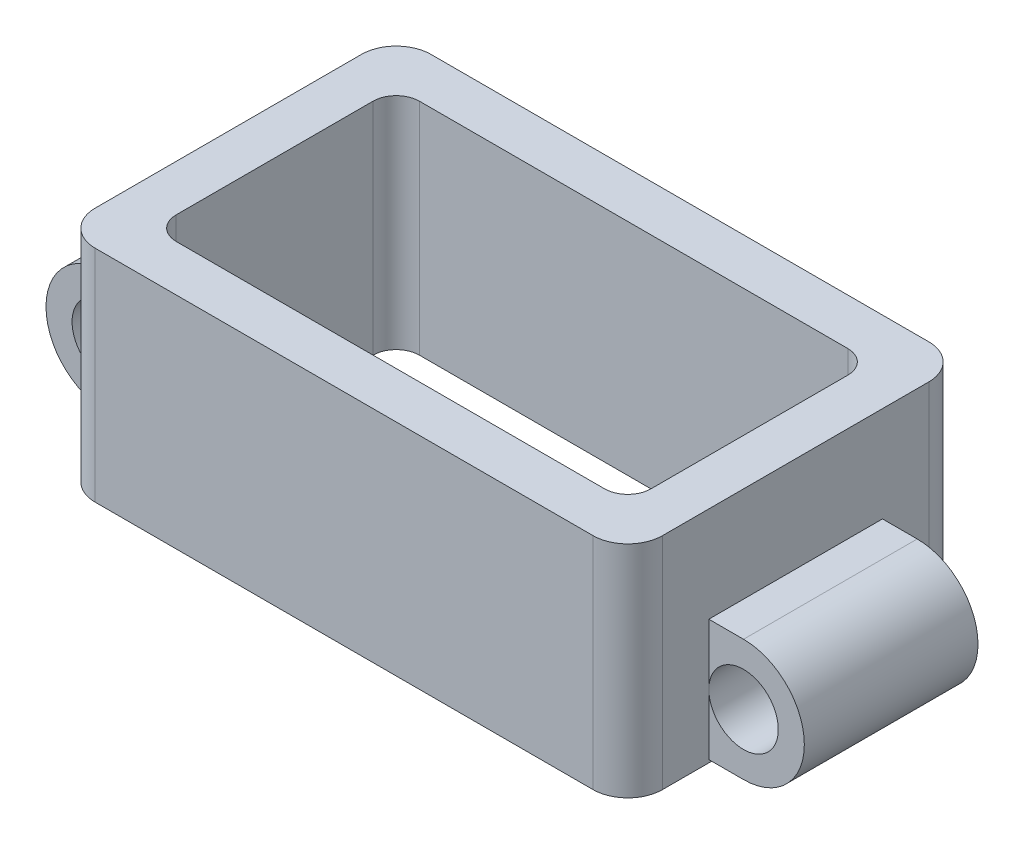
ISO-10303-21;
HEADER;
FILE_DESCRIPTION(('STEP AP214'),'2;1');
FILE_NAME('part.step','',(''),(''),'','','');
FILE_SCHEMA(('AUTOMOTIVE_DESIGN { 1 0 10303 214 1 1 1 1 }'));
ENDSEC;
DATA;
#1=APPLICATION_CONTEXT('core data for automotive mechanical design processes');
#2=APPLICATION_PROTOCOL_DEFINITION('international standard','automotive_design',2000,#1);
#3=PRODUCT_CONTEXT('',#1,'mechanical');
#4=PRODUCT('Part','Part','',(#3));
#5=PRODUCT_RELATED_PRODUCT_CATEGORY('part','',(#4));
#6=PRODUCT_DEFINITION_FORMATION('','',#4);
#7=PRODUCT_DEFINITION_CONTEXT('part definition',#1,'design');
#8=PRODUCT_DEFINITION('design','',#6,#7);
#9=PRODUCT_DEFINITION_SHAPE('','',#8);
#10=(LENGTH_UNIT() NAMED_UNIT(*) SI_UNIT(.MILLI.,.METRE.));
#11=(NAMED_UNIT(*) PLANE_ANGLE_UNIT() SI_UNIT($,.RADIAN.));
#12=(NAMED_UNIT(*) SI_UNIT($,.STERADIAN.) SOLID_ANGLE_UNIT());
#13=UNCERTAINTY_MEASURE_WITH_UNIT(LENGTH_MEASURE(1.E-05),#10,'distance_accuracy_value','');
#14=(GEOMETRIC_REPRESENTATION_CONTEXT(3) GLOBAL_UNCERTAINTY_ASSIGNED_CONTEXT((#13)) GLOBAL_UNIT_ASSIGNED_CONTEXT((#10,
#11,#12)) REPRESENTATION_CONTEXT('',''));
#15=CARTESIAN_POINT('',(0.,0.,0.));
#16=DIRECTION('',(0.,0.,1.));
#17=DIRECTION('',(1.,0.,0.));
#18=AXIS2_PLACEMENT_3D('',#15,#16,#17);
#19=CARTESIAN_POINT('',(10.9204858758298,10.75,26.156539988134));
#20=DIRECTION('',(0.,-1.,0.));
#21=DIRECTION('',(0.,0.,-1.));
#22=AXIS2_PLACEMENT_3D('',#19,#20,#21);
#23=PLANE('',#22);
#24=DIRECTION('',(0.,0.,-1.));
#25=VECTOR('',#24,1.);
#26=CARTESIAN_POINT('',(-5.07951412417015,10.75,33.157539988134));
#27=LINE('',#26,#25);
#28=CARTESIAN_POINT('',(-5.07951412417015,10.75,26.156539988134));
#29=VERTEX_POINT('',#28);
#30=CARTESIAN_POINT('',(-5.07951412417016,10.75,11.156539988134));
#31=VERTEX_POINT('',#30);
#32=EDGE_CURVE('E205',#29,#31,#27,.T.);
#33=ORIENTED_EDGE('',*,*,#32,.T.);
#34=DIRECTION('',(-1.,0.,0.));
#35=VECTOR('',#34,1.);
#36=CARTESIAN_POINT('',(10.9204858758298,10.75,11.156539988134));
#37=LINE('',#36,#35);
#38=CARTESIAN_POINT('',(-8.07951412417015,10.75,11.156539988134));
#39=VERTEX_POINT('',#38);
#40=EDGE_CURVE('E228',#31,#39,#37,.T.);
#41=ORIENTED_EDGE('',*,*,#40,.T.);
#42=DIRECTION('',(0.,0.,1.));
#43=VECTOR('',#42,1.);
#44=CARTESIAN_POINT('',(-8.07951412417015,10.75,26.156539988134));
#45=LINE('',#44,#43);
#46=CARTESIAN_POINT('',(-8.07951412417015,10.75,26.156539988134));
#47=VERTEX_POINT('',#46);
#48=EDGE_CURVE('E637',#39,#47,#45,.T.);
#49=ORIENTED_EDGE('',*,*,#48,.T.);
#50=DIRECTION('',(-1.,0.,0.));
#51=VECTOR('',#50,1.);
#52=CARTESIAN_POINT('',(10.9204858758298,10.75,26.156539988134));
#53=LINE('',#52,#51);
#54=EDGE_CURVE('E640',#29,#47,#53,.T.);
#55=ORIENTED_EDGE('',*,*,#54,.F.);
#56=EDGE_LOOP('',(#33,#41,#49,#55));
#57=FACE_BOUND('',#56,.T.);
#58=ADVANCED_FACE('F32',(#57),#23,.F.);
#59=CARTESIAN_POINT('',(-57.0795141241702,19.,4.15653998813402));
#60=DIRECTION('',(1.,0.,0.));
#61=DIRECTION('',(0.,0.,-1.));
#62=AXIS2_PLACEMENT_3D('',#59,#60,#61);
#63=PLANE('',#62);
#64=DIRECTION('',(0.,0.,1.));
#65=VECTOR('',#64,1.);
#66=CARTESIAN_POINT('',(-57.0795141241702,19.,4.15653998813402));
#67=LINE('',#66,#65);
#68=CARTESIAN_POINT('',(-57.0795141241702,19.,7.15653998813402));
#69=VERTEX_POINT('',#68);
#70=CARTESIAN_POINT('',(-57.0795141241702,19.,30.156539988134));
#71=VERTEX_POINT('',#70);
#72=EDGE_CURVE('E253',#69,#71,#67,.T.);
#73=ORIENTED_EDGE('',*,*,#72,.F.);
#74=DIRECTION('',(0.,-1.,0.));
#75=VECTOR('',#74,1.);
#76=CARTESIAN_POINT('',(-57.0795141241702,19.,7.15653998813402));
#77=LINE('',#76,#75);
#78=CARTESIAN_POINT('',(-57.0795141241702,0.,7.15653998813402));
#79=VERTEX_POINT('',#78);
#80=EDGE_CURVE('E278',#69,#79,#77,.T.);
#81=ORIENTED_EDGE('',*,*,#80,.T.);
#82=DIRECTION('',(0.,0.,1.));
#83=VECTOR('',#82,1.);
#84=CARTESIAN_POINT('',(-57.0795141241702,0.,4.15653998813402));
#85=LINE('',#84,#83);
#86=CARTESIAN_POINT('',(-57.0795141241702,0.,30.156539988134));
#87=VERTEX_POINT('',#86);
#88=EDGE_CURVE('E244',#79,#87,#85,.T.);
#89=ORIENTED_EDGE('',*,*,#88,.T.);
#90=DIRECTION('',(0.,-1.,0.));
#91=VECTOR('',#90,1.);
#92=CARTESIAN_POINT('',(-57.0795141241702,19.,30.156539988134));
#93=LINE('',#92,#91);
#94=EDGE_CURVE('E266',#87,#71,#93,.F.);
#95=ORIENTED_EDGE('',*,*,#94,.T.);
#96=EDGE_LOOP('',(#73,#81,#89,#95));
#97=FACE_BOUND('',#96,.T.);
#98=DIRECTION('',(0.,0.,-1.));
#99=VECTOR('',#98,1.);
#100=CARTESIAN_POINT('',(-57.0795141241702,10.75,26.156539988134));
#101=LINE('',#100,#99);
#102=CARTESIAN_POINT('',(-57.0795141241702,10.75,26.156539988134));
#103=VERTEX_POINT('',#102);
#104=CARTESIAN_POINT('',(-57.0795141241702,10.75,11.156539988134));
#105=VERTEX_POINT('',#104);
#106=EDGE_CURVE('E605',#103,#105,#101,.T.);
#107=ORIENTED_EDGE('',*,*,#106,.F.);
#108=DIRECTION('',(0.,-1.,0.));
#109=VECTOR('',#108,1.);
#110=CARTESIAN_POINT('',(-57.0795141241702,10.75,26.156539988134));
#111=LINE('',#110,#109);
#112=CARTESIAN_POINT('',(-57.0795141241702,5.5,26.156539988134));
#113=VERTEX_POINT('',#112);
#114=EDGE_CURVE('E618',#103,#113,#111,.T.);
#115=ORIENTED_EDGE('',*,*,#114,.T.);
#116=CARTESIAN_POINT('',(-57.0795141241702,0.25,26.156539988134));
#117=VERTEX_POINT('',#116);
#118=EDGE_CURVE('E617',#113,#117,#111,.T.);
#119=ORIENTED_EDGE('',*,*,#118,.T.);
#120=DIRECTION('',(0.,0.,-1.));
#121=VECTOR('',#120,1.);
#122=CARTESIAN_POINT('',(-57.0795141241702,0.25,26.156539988134));
#123=LINE('',#122,#121);
#124=CARTESIAN_POINT('',(-57.0795141241702,0.249999999999998,11.156539988134));
#125=VERTEX_POINT('',#124);
#126=EDGE_CURVE('E614',#117,#125,#123,.T.);
#127=ORIENTED_EDGE('',*,*,#126,.T.);
#128=DIRECTION('',(0.,-1.,0.));
#129=VECTOR('',#128,1.);
#130=CARTESIAN_POINT('',(-57.0795141241702,10.75,11.156539988134));
#131=LINE('',#130,#129);
#132=CARTESIAN_POINT('',(-57.0795141241702,5.5,11.156539988134));
#133=VERTEX_POINT('',#132);
#134=EDGE_CURVE('E610',#133,#125,#131,.T.);
#135=ORIENTED_EDGE('',*,*,#134,.F.);
#136=EDGE_CURVE('E611',#105,#133,#131,.T.);
#137=ORIENTED_EDGE('',*,*,#136,.F.);
#138=EDGE_LOOP('',(#107,#115,#119,#127,#135,#137));
#139=FACE_BOUND('',#138,.T.);
#140=ADVANCED_FACE('F389',(#97,#139),#63,.F.);
#141=CARTESIAN_POINT('',(-8.07951412417016,19.,4.15653998813402));
#142=DIRECTION('',(-1.,0.,0.));
#143=DIRECTION('',(0.,0.,1.));
#144=AXIS2_PLACEMENT_3D('',#141,#142,#143);
#145=PLANE('',#144);
#146=DIRECTION('',(0.,0.,-1.));
#147=VECTOR('',#146,1.);
#148=CARTESIAN_POINT('',(-8.07951412417016,0.,4.15653998813402));
#149=LINE('',#148,#147);
#150=CARTESIAN_POINT('',(-8.07951412417015,0.,30.156539988134));
#151=VERTEX_POINT('',#150);
#152=CARTESIAN_POINT('',(-8.07951412417016,0.,7.15653998813401));
#153=VERTEX_POINT('',#152);
#154=EDGE_CURVE('E272',#151,#153,#149,.T.);
#155=ORIENTED_EDGE('',*,*,#154,.T.);
#156=DIRECTION('',(0.,-1.,0.));
#157=VECTOR('',#156,1.);
#158=CARTESIAN_POINT('',(-8.07951412417016,19.,7.15653998813402));
#159=LINE('',#158,#157);
#160=CARTESIAN_POINT('',(-8.07951412417016,19.,7.15653998813401));
#161=VERTEX_POINT('',#160);
#162=EDGE_CURVE('E310',#153,#161,#159,.F.);
#163=ORIENTED_EDGE('',*,*,#162,.T.);
#164=DIRECTION('',(0.,0.,-1.));
#165=VECTOR('',#164,1.);
#166=CARTESIAN_POINT('',(-8.07951412417016,19.,4.15653998813402));
#167=LINE('',#166,#165);
#168=CARTESIAN_POINT('',(-8.07951412417015,19.,30.156539988134));
#169=VERTEX_POINT('',#168);
#170=EDGE_CURVE('E260',#169,#161,#167,.T.);
#171=ORIENTED_EDGE('',*,*,#170,.F.);
#172=DIRECTION('',(0.,-1.,0.));
#173=VECTOR('',#172,1.);
#174=CARTESIAN_POINT('',(-8.07951412417015,19.,30.156539988134));
#175=LINE('',#174,#173);
#176=EDGE_CURVE('E307',#169,#151,#175,.T.);
#177=ORIENTED_EDGE('',*,*,#176,.T.);
#178=EDGE_LOOP('',(#155,#163,#171,#177));
#179=FACE_BOUND('',#178,.T.);
#180=DIRECTION('',(0.,-1.,0.));
#181=VECTOR('',#180,1.);
#182=CARTESIAN_POINT('',(-8.07951412417015,0.25,26.156539988134));
#183=LINE('',#182,#181);
#184=CARTESIAN_POINT('',(-8.07951412417015,5.5,26.156539988134));
#185=VERTEX_POINT('',#184);
#186=EDGE_CURVE('E629',#47,#185,#183,.T.);
#187=ORIENTED_EDGE('',*,*,#186,.F.);
#188=ORIENTED_EDGE('',*,*,#48,.F.);
#189=DIRECTION('',(0.,1.,0.));
#190=VECTOR('',#189,1.);
#191=CARTESIAN_POINT('',(-8.07951412417015,0.25,11.156539988134));
#192=LINE('',#191,#190);
#193=CARTESIAN_POINT('',(-8.07951412417015,5.5,11.156539988134));
#194=VERTEX_POINT('',#193);
#195=EDGE_CURVE('E634',#194,#39,#192,.T.);
#196=ORIENTED_EDGE('',*,*,#195,.F.);
#197=CARTESIAN_POINT('',(-8.07951412417015,0.25,11.156539988134));
#198=VERTEX_POINT('',#197);
#199=EDGE_CURVE('E635',#198,#194,#192,.T.);
#200=ORIENTED_EDGE('',*,*,#199,.F.);
#201=DIRECTION('',(0.,0.,-1.));
#202=VECTOR('',#201,1.);
#203=CARTESIAN_POINT('',(-8.07951412417015,0.25,26.156539988134));
#204=LINE('',#203,#202);
#205=CARTESIAN_POINT('',(-8.07951412417015,0.25,26.156539988134));
#206=VERTEX_POINT('',#205);
#207=EDGE_CURVE('E632',#206,#198,#204,.T.);
#208=ORIENTED_EDGE('',*,*,#207,.F.);
#209=EDGE_CURVE('E221',#185,#206,#183,.T.);
#210=ORIENTED_EDGE('',*,*,#209,.F.);
#211=EDGE_LOOP('',(#187,#188,#196,#200,#208,#210));
#212=FACE_BOUND('',#211,.T.);
#213=ADVANCED_FACE('F395',(#179,#212),#145,.F.);
#214=CARTESIAN_POINT('',(0.,19.,0.));
#215=DIRECTION('',(0.,1.,0.));
#216=DIRECTION('',(0.,0.,1.));
#217=AXIS2_PLACEMENT_3D('',#214,#215,#216);
#218=PLANE('',#217);
#219=DIRECTION('',(-1.,0.,0.));
#220=VECTOR('',#219,1.);
#221=CARTESIAN_POINT('',(-57.0795141241702,19.,4.15653998813402));
#222=LINE('',#221,#220);
#223=CARTESIAN_POINT('',(-11.0795141241702,19.,4.15653998813402));
#224=VERTEX_POINT('',#223);
#225=CARTESIAN_POINT('',(-54.0795141241702,19.,4.15653998813402));
#226=VERTEX_POINT('',#225);
#227=EDGE_CURVE('E263',#224,#226,#222,.T.);
#228=ORIENTED_EDGE('',*,*,#227,.T.);
#229=CARTESIAN_POINT('',(-54.0795141241702,19.,7.15653998813402));
#230=DIRECTION('',(0.,1.,0.));
#231=DIRECTION('',(0.,0.,1.));
#232=AXIS2_PLACEMENT_3D('',#229,#230,#231);
#233=CIRCLE('',#232,3.);
#234=EDGE_CURVE('E300',#226,#69,#233,.T.);
#235=ORIENTED_EDGE('',*,*,#234,.T.);
#236=ORIENTED_EDGE('',*,*,#72,.T.);
#237=CARTESIAN_POINT('',(-54.0795141241701,19.,30.156539988134));
#238=DIRECTION('',(0.,1.,0.));
#239=DIRECTION('',(0.,0.,1.));
#240=AXIS2_PLACEMENT_3D('',#237,#238,#239);
#241=CIRCLE('',#240,3.);
#242=CARTESIAN_POINT('',(-54.0795141241701,19.,33.156539988134));
#243=VERTEX_POINT('',#242);
#244=EDGE_CURVE('E298',#71,#243,#241,.T.);
#245=ORIENTED_EDGE('',*,*,#244,.T.);
#246=DIRECTION('',(1.,0.,0.));
#247=VECTOR('',#246,1.);
#248=CARTESIAN_POINT('',(-57.0795141241702,19.,33.156539988134));
#249=LINE('',#248,#247);
#250=CARTESIAN_POINT('',(-11.0795141241702,19.,33.156539988134));
#251=VERTEX_POINT('',#250);
#252=EDGE_CURVE('E256',#243,#251,#249,.T.);
#253=ORIENTED_EDGE('',*,*,#252,.T.);
#254=CARTESIAN_POINT('',(-11.0795141241701,19.,30.156539988134));
#255=DIRECTION('',(0.,1.,0.));
#256=DIRECTION('',(0.,0.,1.));
#257=AXIS2_PLACEMENT_3D('',#254,#255,#256);
#258=CIRCLE('',#257,3.);
#259=EDGE_CURVE('E294',#251,#169,#258,.T.);
#260=ORIENTED_EDGE('',*,*,#259,.T.);
#261=ORIENTED_EDGE('',*,*,#170,.T.);
#262=CARTESIAN_POINT('',(-11.0795141241702,19.,7.15653998813402));
#263=DIRECTION('',(0.,1.,0.));
#264=DIRECTION('',(0.,0.,1.));
#265=AXIS2_PLACEMENT_3D('',#262,#263,#264);
#266=CIRCLE('',#265,3.);
#267=EDGE_CURVE('E296',#161,#224,#266,.T.);
#268=ORIENTED_EDGE('',*,*,#267,.T.);
#269=EDGE_LOOP('',(#228,#235,#236,#245,#253,#260,#261,#268));
#270=FACE_BOUND('',#269,.T.);
#271=DIRECTION('',(1.,0.,0.));
#272=VECTOR('',#271,1.);
#273=CARTESIAN_POINT('',(-53.0795141241702,19.,29.156539988134));
#274=LINE('',#273,#272);
#275=CARTESIAN_POINT('',(-51.0795141241702,19.,29.156539988134));
#276=VERTEX_POINT('',#275);
#277=CARTESIAN_POINT('',(-14.0795141241702,19.,29.156539988134));
#278=VERTEX_POINT('',#277);
#279=EDGE_CURVE('E235',#276,#278,#274,.T.);
#280=ORIENTED_EDGE('',*,*,#279,.F.);
#281=CARTESIAN_POINT('',(-51.0795141241702,19.,27.156539988134));
#282=DIRECTION('',(0.,1.,0.));
#283=DIRECTION('',(0.,0.,1.));
#284=AXIS2_PLACEMENT_3D('',#281,#282,#283);
#285=CIRCLE('',#284,2.);
#286=CARTESIAN_POINT('',(-53.0795141241702,19.,27.156539988134));
#287=VERTEX_POINT('',#286);
#288=EDGE_CURVE('E342',#276,#287,#285,.F.);
#289=ORIENTED_EDGE('',*,*,#288,.T.);
#290=DIRECTION('',(0.,0.,1.));
#291=VECTOR('',#290,1.);
#292=CARTESIAN_POINT('',(-53.0795141241702,19.,8.15653998813402));
#293=LINE('',#292,#291);
#294=CARTESIAN_POINT('',(-53.0795141241702,19.,10.156539988134));
#295=VERTEX_POINT('',#294);
#296=EDGE_CURVE('E232',#295,#287,#293,.T.);
#297=ORIENTED_EDGE('',*,*,#296,.F.);
#298=CARTESIAN_POINT('',(-51.0795141241702,19.,10.156539988134));
#299=DIRECTION('',(0.,1.,0.));
#300=DIRECTION('',(0.,0.,1.));
#301=AXIS2_PLACEMENT_3D('',#298,#299,#300);
#302=CIRCLE('',#301,2.);
#303=CARTESIAN_POINT('',(-51.0795141241702,19.,8.15653998813402));
#304=VERTEX_POINT('',#303);
#305=EDGE_CURVE('E11',#295,#304,#302,.F.);
#306=ORIENTED_EDGE('',*,*,#305,.T.);
#307=DIRECTION('',(-1.,0.,0.));
#308=VECTOR('',#307,1.);
#309=CARTESIAN_POINT('',(-53.0795141241702,19.,8.15653998813402));
#310=LINE('',#309,#308);
#311=CARTESIAN_POINT('',(-14.0795141241702,19.,8.15653998813402));
#312=VERTEX_POINT('',#311);
#313=EDGE_CURVE('E242',#312,#304,#310,.T.);
#314=ORIENTED_EDGE('',*,*,#313,.F.);
#315=CARTESIAN_POINT('',(-14.0795141241702,19.,10.156539988134));
#316=DIRECTION('',(0.,1.,0.));
#317=DIRECTION('',(0.,0.,1.));
#318=AXIS2_PLACEMENT_3D('',#315,#316,#317);
#319=CIRCLE('',#318,2.);
#320=CARTESIAN_POINT('',(-12.0795141241702,19.,10.156539988134));
#321=VERTEX_POINT('',#320);
#322=EDGE_CURVE('E334',#312,#321,#319,.F.);
#323=ORIENTED_EDGE('',*,*,#322,.T.);
#324=DIRECTION('',(0.,0.,-1.));
#325=VECTOR('',#324,1.);
#326=CARTESIAN_POINT('',(-12.0795141241702,19.,8.15653998813402));
#327=LINE('',#326,#325);
#328=CARTESIAN_POINT('',(-12.0795141241702,19.,27.156539988134));
#329=VERTEX_POINT('',#328);
#330=EDGE_CURVE('E239',#329,#321,#327,.T.);
#331=ORIENTED_EDGE('',*,*,#330,.F.);
#332=CARTESIAN_POINT('',(-14.0795141241702,19.,27.156539988134));
#333=DIRECTION('',(0.,1.,0.));
#334=DIRECTION('',(0.,0.,1.));
#335=AXIS2_PLACEMENT_3D('',#332,#333,#334);
#336=CIRCLE('',#335,2.);
#337=EDGE_CURVE('E338',#329,#278,#336,.F.);
#338=ORIENTED_EDGE('',*,*,#337,.T.);
#339=EDGE_LOOP('',(#280,#289,#297,#306,#314,#323,#331,#338));
#340=FACE_BOUND('',#339,.T.);
#341=ADVANCED_FACE('F358',(#270,#340),#218,.T.);
#342=CARTESIAN_POINT('',(0.,0.,0.));
#343=DIRECTION('',(0.,1.,0.));
#344=DIRECTION('',(0.,0.,1.));
#345=AXIS2_PLACEMENT_3D('',#342,#343,#344);
#346=PLANE('',#345);
#347=ORIENTED_EDGE('',*,*,#88,.F.);
#348=CARTESIAN_POINT('',(-54.0795141241702,0.,7.15653998813402));
#349=DIRECTION('',(0.,1.,0.));
#350=DIRECTION('',(0.,0.,1.));
#351=AXIS2_PLACEMENT_3D('',#348,#349,#350);
#352=CIRCLE('',#351,3.);
#353=CARTESIAN_POINT('',(-54.0795141241702,0.,4.15653998813402));
#354=VERTEX_POINT('',#353);
#355=EDGE_CURVE('E287',#79,#354,#352,.F.);
#356=ORIENTED_EDGE('',*,*,#355,.T.);
#357=DIRECTION('',(-1.,0.,0.));
#358=VECTOR('',#357,1.);
#359=CARTESIAN_POINT('',(-57.0795141241702,0.,4.15653998813402));
#360=LINE('',#359,#358);
#361=CARTESIAN_POINT('',(-11.0795141241702,0.,4.15653998813402));
#362=VERTEX_POINT('',#361);
#363=EDGE_CURVE('E257',#362,#354,#360,.T.);
#364=ORIENTED_EDGE('',*,*,#363,.F.);
#365=CARTESIAN_POINT('',(-11.0795141241702,0.,7.15653998813402));
#366=DIRECTION('',(0.,1.,0.));
#367=DIRECTION('',(0.,0.,1.));
#368=AXIS2_PLACEMENT_3D('',#365,#366,#367);
#369=CIRCLE('',#368,3.);
#370=EDGE_CURVE('E283',#362,#153,#369,.F.);
#371=ORIENTED_EDGE('',*,*,#370,.T.);
#372=ORIENTED_EDGE('',*,*,#154,.F.);
#373=CARTESIAN_POINT('',(-11.0795141241701,0.,30.156539988134));
#374=DIRECTION('',(0.,1.,0.));
#375=DIRECTION('',(0.,0.,1.));
#376=AXIS2_PLACEMENT_3D('',#373,#374,#375);
#377=CIRCLE('',#376,3.);
#378=CARTESIAN_POINT('',(-11.0795141241702,0.,33.156539988134));
#379=VERTEX_POINT('',#378);
#380=EDGE_CURVE('E281',#151,#379,#377,.F.);
#381=ORIENTED_EDGE('',*,*,#380,.T.);
#382=DIRECTION('',(1.,0.,0.));
#383=VECTOR('',#382,1.);
#384=CARTESIAN_POINT('',(-57.0795141241702,0.,33.156539988134));
#385=LINE('',#384,#383);
#386=CARTESIAN_POINT('',(-54.0795141241701,0.,33.156539988134));
#387=VERTEX_POINT('',#386);
#388=EDGE_CURVE('E269',#387,#379,#385,.T.);
#389=ORIENTED_EDGE('',*,*,#388,.F.);
#390=CARTESIAN_POINT('',(-54.0795141241701,0.,30.156539988134));
#391=DIRECTION('',(0.,1.,0.));
#392=DIRECTION('',(0.,0.,1.));
#393=AXIS2_PLACEMENT_3D('',#390,#391,#392);
#394=CIRCLE('',#393,3.);
#395=EDGE_CURVE('E285',#387,#87,#394,.F.);
#396=ORIENTED_EDGE('',*,*,#395,.T.);
#397=EDGE_LOOP('',(#347,#356,#364,#371,#372,#381,#389,#396));
#398=FACE_BOUND('',#397,.T.);
#399=DIRECTION('',(-1.,0.,0.));
#400=VECTOR('',#399,1.);
#401=CARTESIAN_POINT('',(-53.0795141241702,0.,8.15653998813402));
#402=LINE('',#401,#400);
#403=CARTESIAN_POINT('',(-14.0795141241702,0.,8.15653998813402));
#404=VERTEX_POINT('',#403);
#405=CARTESIAN_POINT('',(-51.0795141241702,0.,8.15653998813402));
#406=VERTEX_POINT('',#405);
#407=EDGE_CURVE('E236',#404,#406,#402,.T.);
#408=ORIENTED_EDGE('',*,*,#407,.T.);
#409=CARTESIAN_POINT('',(-51.0795141241702,0.,10.156539988134));
#410=DIRECTION('',(0.,1.,0.));
#411=DIRECTION('',(0.,0.,1.));
#412=AXIS2_PLACEMENT_3D('',#409,#410,#411);
#413=CIRCLE('',#412,2.);
#414=CARTESIAN_POINT('',(-53.0795141241702,0.,10.156539988134));
#415=VERTEX_POINT('',#414);
#416=EDGE_CURVE('E40',#406,#415,#413,.T.);
#417=ORIENTED_EDGE('',*,*,#416,.T.);
#418=DIRECTION('',(0.,0.,1.));
#419=VECTOR('',#418,1.);
#420=CARTESIAN_POINT('',(-53.0795141241702,0.,8.15653998813402));
#421=LINE('',#420,#419);
#422=CARTESIAN_POINT('',(-53.0795141241702,0.,27.156539988134));
#423=VERTEX_POINT('',#422);
#424=EDGE_CURVE('E223',#415,#423,#421,.T.);
#425=ORIENTED_EDGE('',*,*,#424,.T.);
#426=CARTESIAN_POINT('',(-51.0795141241702,0.,27.156539988134));
#427=DIRECTION('',(0.,1.,0.));
#428=DIRECTION('',(0.,0.,1.));
#429=AXIS2_PLACEMENT_3D('',#426,#427,#428);
#430=CIRCLE('',#429,2.);
#431=CARTESIAN_POINT('',(-51.0795141241702,0.,29.156539988134));
#432=VERTEX_POINT('',#431);
#433=EDGE_CURVE('E340',#423,#432,#430,.T.);
#434=ORIENTED_EDGE('',*,*,#433,.T.);
#435=DIRECTION('',(1.,0.,0.));
#436=VECTOR('',#435,1.);
#437=CARTESIAN_POINT('',(-53.0795141241702,0.,29.156539988134));
#438=LINE('',#437,#436);
#439=CARTESIAN_POINT('',(-14.0795141241702,0.,29.156539988134));
#440=VERTEX_POINT('',#439);
#441=EDGE_CURVE('E226',#432,#440,#438,.T.);
#442=ORIENTED_EDGE('',*,*,#441,.T.);
#443=CARTESIAN_POINT('',(-14.0795141241702,0.,27.156539988134));
#444=DIRECTION('',(0.,1.,0.));
#445=DIRECTION('',(0.,0.,1.));
#446=AXIS2_PLACEMENT_3D('',#443,#444,#445);
#447=CIRCLE('',#446,2.);
#448=CARTESIAN_POINT('',(-12.0795141241702,0.,27.156539988134));
#449=VERTEX_POINT('',#448);
#450=EDGE_CURVE('E336',#440,#449,#447,.T.);
#451=ORIENTED_EDGE('',*,*,#450,.T.);
#452=DIRECTION('',(0.,0.,-1.));
#453=VECTOR('',#452,1.);
#454=CARTESIAN_POINT('',(-12.0795141241702,0.,8.15653998813402));
#455=LINE('',#454,#453);
#456=CARTESIAN_POINT('',(-12.0795141241702,0.,10.156539988134));
#457=VERTEX_POINT('',#456);
#458=EDGE_CURVE('E248',#449,#457,#455,.T.);
#459=ORIENTED_EDGE('',*,*,#458,.T.);
#460=CARTESIAN_POINT('',(-14.0795141241702,0.,10.156539988134));
#461=DIRECTION('',(0.,1.,0.));
#462=DIRECTION('',(0.,0.,1.));
#463=AXIS2_PLACEMENT_3D('',#460,#461,#462);
#464=CIRCLE('',#463,2.);
#465=EDGE_CURVE('E332',#457,#404,#464,.T.);
#466=ORIENTED_EDGE('',*,*,#465,.T.);
#467=EDGE_LOOP('',(#408,#417,#425,#434,#442,#451,#459,#466));
#468=FACE_BOUND('',#467,.T.);
#469=ADVANCED_FACE('F345',(#398,#468),#346,.F.);
#470=CARTESIAN_POINT('',(-57.0795141241702,19.,33.156539988134));
#471=DIRECTION('',(0.,0.,-1.));
#472=DIRECTION('',(-1.,0.,0.));
#473=AXIS2_PLACEMENT_3D('',#470,#471,#472);
#474=PLANE('',#473);
#475=ORIENTED_EDGE('',*,*,#252,.F.);
#476=DIRECTION('',(0.,-1.,0.));
#477=VECTOR('',#476,1.);
#478=CARTESIAN_POINT('',(-54.0795141241701,19.,33.156539988134));
#479=LINE('',#478,#477);
#480=EDGE_CURVE('E304',#243,#387,#479,.T.);
#481=ORIENTED_EDGE('',*,*,#480,.T.);
#482=ORIENTED_EDGE('',*,*,#388,.T.);
#483=DIRECTION('',(0.,-1.,0.));
#484=VECTOR('',#483,1.);
#485=CARTESIAN_POINT('',(-11.0795141241702,19.,33.156539988134));
#486=LINE('',#485,#484);
#487=EDGE_CURVE('E302',#379,#251,#486,.F.);
#488=ORIENTED_EDGE('',*,*,#487,.T.);
#489=EDGE_LOOP('',(#475,#481,#482,#488));
#490=FACE_BOUND('',#489,.T.);
#491=ADVANCED_FACE('F425',(#490),#474,.F.);
#492=CARTESIAN_POINT('',(-57.0795141241702,19.,4.15653998813402));
#493=DIRECTION('',(0.,0.,1.));
#494=DIRECTION('',(1.,0.,0.));
#495=AXIS2_PLACEMENT_3D('',#492,#493,#494);
#496=PLANE('',#495);
#497=ORIENTED_EDGE('',*,*,#363,.T.);
#498=DIRECTION('',(0.,-1.,0.));
#499=VECTOR('',#498,1.);
#500=CARTESIAN_POINT('',(-54.0795141241702,19.,4.15653998813402));
#501=LINE('',#500,#499);
#502=EDGE_CURVE('E292',#354,#226,#501,.F.);
#503=ORIENTED_EDGE('',*,*,#502,.T.);
#504=ORIENTED_EDGE('',*,*,#227,.F.);
#505=DIRECTION('',(0.,-1.,0.));
#506=VECTOR('',#505,1.);
#507=CARTESIAN_POINT('',(-11.0795141241702,19.,4.15653998813402));
#508=LINE('',#507,#506);
#509=EDGE_CURVE('E289',#224,#362,#508,.T.);
#510=ORIENTED_EDGE('',*,*,#509,.T.);
#511=EDGE_LOOP('',(#497,#503,#504,#510));
#512=FACE_BOUND('',#511,.T.);
#513=ADVANCED_FACE('F419',(#512),#496,.F.);
#514=CARTESIAN_POINT('',(-53.0795141241702,19.,8.15653998813402));
#515=DIRECTION('',(1.,0.,0.));
#516=DIRECTION('',(0.,0.,-1.));
#517=AXIS2_PLACEMENT_3D('',#514,#515,#516);
#518=PLANE('',#517);
#519=ORIENTED_EDGE('',*,*,#296,.T.);
#520=DIRECTION('',(0.,-1.,0.));
#521=VECTOR('',#520,1.);
#522=CARTESIAN_POINT('',(-53.0795141241702,0.,27.156539988134));
#523=LINE('',#522,#521);
#524=EDGE_CURVE('E329',#287,#423,#523,.T.);
#525=ORIENTED_EDGE('',*,*,#524,.T.);
#526=ORIENTED_EDGE('',*,*,#424,.F.);
#527=DIRECTION('',(0.,-1.,0.));
#528=VECTOR('',#527,1.);
#529=CARTESIAN_POINT('',(-53.0795141241702,19.,10.156539988134));
#530=LINE('',#529,#528);
#531=EDGE_CURVE('E327',#415,#295,#530,.F.);
#532=ORIENTED_EDGE('',*,*,#531,.T.);
#533=EDGE_LOOP('',(#519,#525,#526,#532));
#534=FACE_BOUND('',#533,.T.);
#535=ADVANCED_FACE('F351',(#534),#518,.T.);
#536=CARTESIAN_POINT('',(-53.0795141241702,19.,29.156539988134));
#537=DIRECTION('',(0.,0.,-1.));
#538=DIRECTION('',(-1.,0.,0.));
#539=AXIS2_PLACEMENT_3D('',#536,#537,#538);
#540=PLANE('',#539);
#541=ORIENTED_EDGE('',*,*,#279,.T.);
#542=DIRECTION('',(0.,-1.,0.));
#543=VECTOR('',#542,1.);
#544=CARTESIAN_POINT('',(-14.0795141241702,0.,29.156539988134));
#545=LINE('',#544,#543);
#546=EDGE_CURVE('E324',#278,#440,#545,.T.);
#547=ORIENTED_EDGE('',*,*,#546,.T.);
#548=ORIENTED_EDGE('',*,*,#441,.F.);
#549=DIRECTION('',(0.,-1.,0.));
#550=VECTOR('',#549,1.);
#551=CARTESIAN_POINT('',(-51.0795141241702,19.,29.156539988134));
#552=LINE('',#551,#550);
#553=EDGE_CURVE('E322',#432,#276,#552,.F.);
#554=ORIENTED_EDGE('',*,*,#553,.T.);
#555=EDGE_LOOP('',(#541,#547,#548,#554));
#556=FACE_BOUND('',#555,.T.);
#557=ADVANCED_FACE('F377',(#556),#540,.T.);
#558=CARTESIAN_POINT('',(-12.0795141241702,19.,8.15653998813402));
#559=DIRECTION('',(-1.,0.,0.));
#560=DIRECTION('',(0.,0.,1.));
#561=AXIS2_PLACEMENT_3D('',#558,#559,#560);
#562=PLANE('',#561);
#563=ORIENTED_EDGE('',*,*,#330,.T.);
#564=DIRECTION('',(0.,-1.,0.));
#565=VECTOR('',#564,1.);
#566=CARTESIAN_POINT('',(-12.0795141241702,0.,10.156539988134));
#567=LINE('',#566,#565);
#568=EDGE_CURVE('E314',#321,#457,#567,.T.);
#569=ORIENTED_EDGE('',*,*,#568,.T.);
#570=ORIENTED_EDGE('',*,*,#458,.F.);
#571=DIRECTION('',(0.,-1.,0.));
#572=VECTOR('',#571,1.);
#573=CARTESIAN_POINT('',(-12.0795141241702,19.,27.156539988134));
#574=LINE('',#573,#572);
#575=EDGE_CURVE('E312',#449,#329,#574,.F.);
#576=ORIENTED_EDGE('',*,*,#575,.T.);
#577=EDGE_LOOP('',(#563,#569,#570,#576));
#578=FACE_BOUND('',#577,.T.);
#579=ADVANCED_FACE('F369',(#578),#562,.T.);
#580=CARTESIAN_POINT('',(-53.0795141241702,19.,8.15653998813402));
#581=DIRECTION('',(0.,0.,1.));
#582=DIRECTION('',(1.,0.,0.));
#583=AXIS2_PLACEMENT_3D('',#580,#581,#582);
#584=PLANE('',#583);
#585=ORIENTED_EDGE('',*,*,#407,.F.);
#586=DIRECTION('',(0.,-1.,0.));
#587=VECTOR('',#586,1.);
#588=CARTESIAN_POINT('',(-14.0795141241702,19.,8.15653998813402));
#589=LINE('',#588,#587);
#590=EDGE_CURVE('E320',#404,#312,#589,.F.);
#591=ORIENTED_EDGE('',*,*,#590,.T.);
#592=ORIENTED_EDGE('',*,*,#313,.T.);
#593=DIRECTION('',(0.,-1.,0.));
#594=VECTOR('',#593,1.);
#595=CARTESIAN_POINT('',(-51.0795141241702,0.,8.15653998813402));
#596=LINE('',#595,#594);
#597=EDGE_CURVE('E317',#304,#406,#596,.T.);
#598=ORIENTED_EDGE('',*,*,#597,.T.);
#599=EDGE_LOOP('',(#585,#591,#592,#598));
#600=FACE_BOUND('',#599,.T.);
#601=ADVANCED_FACE('F361',(#600),#584,.T.);
#602=CARTESIAN_POINT('',(-54.0795141241702,19.,7.15653998813402));
#603=DIRECTION('',(0.,-1.,0.));
#604=DIRECTION('',(0.,0.,-1.));
#605=AXIS2_PLACEMENT_3D('',#602,#603,#604);
#606=CYLINDRICAL_SURFACE('',#605,3.);
#607=ORIENTED_EDGE('',*,*,#234,.F.);
#608=ORIENTED_EDGE('',*,*,#502,.F.);
#609=ORIENTED_EDGE('',*,*,#355,.F.);
#610=ORIENTED_EDGE('',*,*,#80,.F.);
#611=EDGE_LOOP('',(#607,#608,#609,#610));
#612=FACE_BOUND('',#611,.T.);
#613=ADVANCED_FACE('F412',(#612),#606,.T.);
#614=CARTESIAN_POINT('',(-54.0795141241701,19.,30.156539988134));
#615=DIRECTION('',(0.,-1.,0.));
#616=DIRECTION('',(0.,0.,-1.));
#617=AXIS2_PLACEMENT_3D('',#614,#615,#616);
#618=CYLINDRICAL_SURFACE('',#617,3.);
#619=ORIENTED_EDGE('',*,*,#244,.F.);
#620=ORIENTED_EDGE('',*,*,#94,.F.);
#621=ORIENTED_EDGE('',*,*,#395,.F.);
#622=ORIENTED_EDGE('',*,*,#480,.F.);
#623=EDGE_LOOP('',(#619,#620,#621,#622));
#624=FACE_BOUND('',#623,.T.);
#625=ADVANCED_FACE('F438',(#624),#618,.T.);
#626=CARTESIAN_POINT('',(-11.0795141241702,19.,7.15653998813402));
#627=DIRECTION('',(0.,-1.,0.));
#628=DIRECTION('',(0.,0.,-1.));
#629=AXIS2_PLACEMENT_3D('',#626,#627,#628);
#630=CYLINDRICAL_SURFACE('',#629,3.);
#631=ORIENTED_EDGE('',*,*,#267,.F.);
#632=ORIENTED_EDGE('',*,*,#162,.F.);
#633=ORIENTED_EDGE('',*,*,#370,.F.);
#634=ORIENTED_EDGE('',*,*,#509,.F.);
#635=EDGE_LOOP('',(#631,#632,#633,#634));
#636=FACE_BOUND('',#635,.T.);
#637=ADVANCED_FACE('F442',(#636),#630,.T.);
#638=CARTESIAN_POINT('',(-11.0795141241701,19.,30.156539988134));
#639=DIRECTION('',(0.,-1.,0.));
#640=DIRECTION('',(0.,0.,-1.));
#641=AXIS2_PLACEMENT_3D('',#638,#639,#640);
#642=CYLINDRICAL_SURFACE('',#641,3.);
#643=ORIENTED_EDGE('',*,*,#259,.F.);
#644=ORIENTED_EDGE('',*,*,#487,.F.);
#645=ORIENTED_EDGE('',*,*,#380,.F.);
#646=ORIENTED_EDGE('',*,*,#176,.F.);
#647=EDGE_LOOP('',(#643,#644,#645,#646));
#648=FACE_BOUND('',#647,.T.);
#649=ADVANCED_FACE('F446',(#648),#642,.T.);
#650=CARTESIAN_POINT('',(-14.0795141241702,19.,10.156539988134));
#651=DIRECTION('',(0.,1.,0.));
#652=DIRECTION('',(0.,0.,1.));
#653=AXIS2_PLACEMENT_3D('',#650,#651,#652);
#654=CYLINDRICAL_SURFACE('',#653,2.);
#655=ORIENTED_EDGE('',*,*,#322,.F.);
#656=ORIENTED_EDGE('',*,*,#590,.F.);
#657=ORIENTED_EDGE('',*,*,#465,.F.);
#658=ORIENTED_EDGE('',*,*,#568,.F.);
#659=EDGE_LOOP('',(#655,#656,#657,#658));
#660=FACE_BOUND('',#659,.T.);
#661=ADVANCED_FACE('F364',(#660),#654,.F.);
#662=CARTESIAN_POINT('',(-14.0795141241702,19.,27.156539988134));
#663=DIRECTION('',(0.,1.,0.));
#664=DIRECTION('',(0.,0.,1.));
#665=AXIS2_PLACEMENT_3D('',#662,#663,#664);
#666=CYLINDRICAL_SURFACE('',#665,2.);
#667=ORIENTED_EDGE('',*,*,#337,.F.);
#668=ORIENTED_EDGE('',*,*,#575,.F.);
#669=ORIENTED_EDGE('',*,*,#450,.F.);
#670=ORIENTED_EDGE('',*,*,#546,.F.);
#671=EDGE_LOOP('',(#667,#668,#669,#670));
#672=FACE_BOUND('',#671,.T.);
#673=ADVANCED_FACE('F373',(#672),#666,.F.);
#674=CARTESIAN_POINT('',(-51.0795141241702,19.,27.156539988134));
#675=DIRECTION('',(0.,1.,0.));
#676=DIRECTION('',(0.,0.,1.));
#677=AXIS2_PLACEMENT_3D('',#674,#675,#676);
#678=CYLINDRICAL_SURFACE('',#677,2.);
#679=ORIENTED_EDGE('',*,*,#288,.F.);
#680=ORIENTED_EDGE('',*,*,#553,.F.);
#681=ORIENTED_EDGE('',*,*,#433,.F.);
#682=ORIENTED_EDGE('',*,*,#524,.F.);
#683=EDGE_LOOP('',(#679,#680,#681,#682));
#684=FACE_BOUND('',#683,.T.);
#685=ADVANCED_FACE('F381',(#684),#678,.F.);
#686=CARTESIAN_POINT('',(-51.0795141241702,19.,10.156539988134));
#687=DIRECTION('',(0.,1.,0.));
#688=DIRECTION('',(0.,0.,1.));
#689=AXIS2_PLACEMENT_3D('',#686,#687,#688);
#690=CYLINDRICAL_SURFACE('',#689,2.);
#691=ORIENTED_EDGE('',*,*,#305,.F.);
#692=ORIENTED_EDGE('',*,*,#531,.F.);
#693=ORIENTED_EDGE('',*,*,#416,.F.);
#694=ORIENTED_EDGE('',*,*,#597,.F.);
#695=EDGE_LOOP('',(#691,#692,#693,#694));
#696=FACE_BOUND('',#695,.T.);
#697=ADVANCED_FACE('F34',(#696),#690,.F.);
#698=CARTESIAN_POINT('',(10.9204858758298,0.25,26.156539988134));
#699=DIRECTION('',(0.,0.,-1.));
#700=DIRECTION('',(-1.,0.,0.));
#701=AXIS2_PLACEMENT_3D('',#698,#699,#700);
#702=PLANE('',#701);
#703=DIRECTION('',(-1.,0.,0.));
#704=VECTOR('',#703,1.);
#705=CARTESIAN_POINT('',(10.9204858758298,0.25,26.156539988134));
#706=LINE('',#705,#704);
#707=CARTESIAN_POINT('',(-5.07951412417015,0.25,26.156539988134));
#708=VERTEX_POINT('',#707);
#709=EDGE_CURVE('E215',#708,#206,#706,.T.);
#710=ORIENTED_EDGE('',*,*,#709,.F.);
#711=CARTESIAN_POINT('',(-5.07951412417015,5.5,26.156539988134));
#712=DIRECTION('',(0.,0.,-1.));
#713=DIRECTION('',(-1.,0.,0.));
#714=AXIS2_PLACEMENT_3D('',#711,#712,#713);
#715=CIRCLE('',#714,5.25);
#716=EDGE_CURVE('E201',#29,#708,#715,.T.);
#717=ORIENTED_EDGE('',*,*,#716,.F.);
#718=ORIENTED_EDGE('',*,*,#54,.T.);
#719=ORIENTED_EDGE('',*,*,#186,.T.);
#720=CARTESIAN_POINT('',(-5.07951412417015,5.5,26.156539988134));
#721=DIRECTION('',(0.,0.,-1.));
#722=DIRECTION('',(-1.,0.,0.));
#723=AXIS2_PLACEMENT_3D('',#720,#721,#722);
#724=CIRCLE('',#723,3.);
#725=EDGE_CURVE('E53',#185,#185,#724,.F.);
#726=ORIENTED_EDGE('',*,*,#725,.F.);
#727=ORIENTED_EDGE('',*,*,#209,.T.);
#728=EDGE_LOOP('',(#710,#717,#718,#719,#726,#727));
#729=FACE_BOUND('',#728,.T.);
#730=ADVANCED_FACE('F219',(#729),#702,.F.);
#731=CARTESIAN_POINT('',(10.9204858758298,0.25,26.156539988134));
#732=DIRECTION('',(0.,1.,0.));
#733=DIRECTION('',(0.,0.,1.));
#734=AXIS2_PLACEMENT_3D('',#731,#732,#733);
#735=PLANE('',#734);
#736=DIRECTION('',(-1.,0.,0.));
#737=VECTOR('',#736,1.);
#738=CARTESIAN_POINT('',(10.9204858758298,0.25,11.156539988134));
#739=LINE('',#738,#737);
#740=CARTESIAN_POINT('',(-5.07951412417016,0.25,11.156539988134));
#741=VERTEX_POINT('',#740);
#742=EDGE_CURVE('E217',#741,#198,#739,.T.);
#743=ORIENTED_EDGE('',*,*,#742,.F.);
#744=DIRECTION('',(0.,0.,-1.));
#745=VECTOR('',#744,1.);
#746=CARTESIAN_POINT('',(-5.07951412417015,0.25,33.157539988134));
#747=LINE('',#746,#745);
#748=EDGE_CURVE('E204',#708,#741,#747,.T.);
#749=ORIENTED_EDGE('',*,*,#748,.F.);
#750=ORIENTED_EDGE('',*,*,#709,.T.);
#751=ORIENTED_EDGE('',*,*,#207,.T.);
#752=EDGE_LOOP('',(#743,#749,#750,#751));
#753=FACE_BOUND('',#752,.T.);
#754=ADVANCED_FACE('F213',(#753),#735,.F.);
#755=CARTESIAN_POINT('',(10.9204858758298,0.25,11.156539988134));
#756=DIRECTION('',(0.,0.,1.));
#757=DIRECTION('',(1.,0.,0.));
#758=AXIS2_PLACEMENT_3D('',#755,#756,#757);
#759=PLANE('',#758);
#760=ORIENTED_EDGE('',*,*,#40,.F.);
#761=CARTESIAN_POINT('',(-5.07951412417016,5.5,11.156539988134));
#762=DIRECTION('',(0.,0.,1.));
#763=DIRECTION('',(1.,0.,0.));
#764=AXIS2_PLACEMENT_3D('',#761,#762,#763);
#765=CIRCLE('',#764,5.25);
#766=EDGE_CURVE('E47',#741,#31,#765,.T.);
#767=ORIENTED_EDGE('',*,*,#766,.F.);
#768=ORIENTED_EDGE('',*,*,#742,.T.);
#769=ORIENTED_EDGE('',*,*,#199,.T.);
#770=CARTESIAN_POINT('',(-5.07951412417016,5.5,11.156539988134));
#771=DIRECTION('',(0.,0.,-1.));
#772=DIRECTION('',(-1.,0.,0.));
#773=AXIS2_PLACEMENT_3D('',#770,#771,#772);
#774=CIRCLE('',#773,3.);
#775=EDGE_CURVE('E209',#194,#194,#774,.T.);
#776=ORIENTED_EDGE('',*,*,#775,.F.);
#777=ORIENTED_EDGE('',*,*,#195,.T.);
#778=EDGE_LOOP('',(#760,#767,#768,#769,#776,#777));
#779=FACE_BOUND('',#778,.T.);
#780=ADVANCED_FACE('F402',(#779),#759,.F.);
#781=CARTESIAN_POINT('',(-76.0795141241701,10.75,26.156539988134));
#782=DIRECTION('',(0.,-1.,0.));
#783=DIRECTION('',(0.,0.,-1.));
#784=AXIS2_PLACEMENT_3D('',#781,#782,#783);
#785=PLANE('',#784);
#786=DIRECTION('',(1.,0.,0.));
#787=VECTOR('',#786,1.);
#788=CARTESIAN_POINT('',(-76.0795141241702,10.75,11.156539988134));
#789=LINE('',#788,#787);
#790=CARTESIAN_POINT('',(-60.0795141241702,10.75,11.156539988134));
#791=VERTEX_POINT('',#790);
#792=EDGE_CURVE('E627',#791,#105,#789,.T.);
#793=ORIENTED_EDGE('',*,*,#792,.F.);
#794=DIRECTION('',(0.,0.,-1.));
#795=VECTOR('',#794,1.);
#796=CARTESIAN_POINT('',(-60.0795141241702,10.75,33.157539988134));
#797=LINE('',#796,#795);
#798=CARTESIAN_POINT('',(-60.0795141241702,10.75,26.156539988134));
#799=VERTEX_POINT('',#798);
#800=EDGE_CURVE('E598',#799,#791,#797,.T.);
#801=ORIENTED_EDGE('',*,*,#800,.F.);
#802=DIRECTION('',(1.,0.,0.));
#803=VECTOR('',#802,1.);
#804=CARTESIAN_POINT('',(-76.0795141241701,10.75,26.156539988134));
#805=LINE('',#804,#803);
#806=EDGE_CURVE('E621',#799,#103,#805,.T.);
#807=ORIENTED_EDGE('',*,*,#806,.T.);
#808=ORIENTED_EDGE('',*,*,#106,.T.);
#809=EDGE_LOOP('',(#793,#801,#807,#808));
#810=FACE_BOUND('',#809,.T.);
#811=ADVANCED_FACE('F400',(#810),#785,.F.);
#812=CARTESIAN_POINT('',(-76.0795141241702,10.75,11.156539988134));
#813=DIRECTION('',(0.,0.,1.));
#814=DIRECTION('',(1.,0.,0.));
#815=AXIS2_PLACEMENT_3D('',#812,#813,#814);
#816=PLANE('',#815);
#817=DIRECTION('',(1.,0.,0.));
#818=VECTOR('',#817,1.);
#819=CARTESIAN_POINT('',(-76.0795141241702,0.249999999999998,11.156539988134));
#820=LINE('',#819,#818);
#821=CARTESIAN_POINT('',(-60.0795141241702,0.249999999999998,11.156539988134));
#822=VERTEX_POINT('',#821);
#823=EDGE_CURVE('E625',#822,#125,#820,.T.);
#824=ORIENTED_EDGE('',*,*,#823,.F.);
#825=CARTESIAN_POINT('',(-60.0795141241702,5.5,11.156539988134));
#826=DIRECTION('',(0.,0.,1.));
#827=DIRECTION('',(-1.,0.,0.));
#828=AXIS2_PLACEMENT_3D('',#825,#826,#827);
#829=CIRCLE('',#828,5.25);
#830=EDGE_CURVE('E595',#791,#822,#829,.T.);
#831=ORIENTED_EDGE('',*,*,#830,.F.);
#832=ORIENTED_EDGE('',*,*,#792,.T.);
#833=ORIENTED_EDGE('',*,*,#136,.T.);
#834=CARTESIAN_POINT('',(-60.0795141241702,5.5,11.156539988134));
#835=DIRECTION('',(0.,0.,-1.));
#836=DIRECTION('',(-1.,0.,0.));
#837=AXIS2_PLACEMENT_3D('',#834,#835,#836);
#838=CIRCLE('',#837,3.00000000000001);
#839=EDGE_CURVE('E603',#133,#133,#838,.T.);
#840=ORIENTED_EDGE('',*,*,#839,.F.);
#841=ORIENTED_EDGE('',*,*,#134,.T.);
#842=EDGE_LOOP('',(#824,#831,#832,#833,#840,#841));
#843=FACE_BOUND('',#842,.T.);
#844=ADVANCED_FACE('F504',(#843),#816,.F.);
#845=CARTESIAN_POINT('',(-76.0795141241701,0.25,26.156539988134));
#846=DIRECTION('',(0.,-1.,0.));
#847=DIRECTION('',(0.,0.,-1.));
#848=AXIS2_PLACEMENT_3D('',#845,#846,#847);
#849=PLANE('',#848);
#850=DIRECTION('',(0.,0.,-1.));
#851=VECTOR('',#850,1.);
#852=CARTESIAN_POINT('',(-60.0795141241702,0.250000000000002,33.157539988134));
#853=LINE('',#852,#851);
#854=CARTESIAN_POINT('',(-60.0795141241702,0.25,26.156539988134));
#855=VERTEX_POINT('',#854);
#856=EDGE_CURVE('E597',#855,#822,#853,.T.);
#857=ORIENTED_EDGE('',*,*,#856,.T.);
#858=ORIENTED_EDGE('',*,*,#823,.T.);
#859=ORIENTED_EDGE('',*,*,#126,.F.);
#860=DIRECTION('',(1.,0.,0.));
#861=VECTOR('',#860,1.);
#862=CARTESIAN_POINT('',(-76.0795141241701,0.25,26.156539988134));
#863=LINE('',#862,#861);
#864=EDGE_CURVE('E623',#855,#117,#863,.T.);
#865=ORIENTED_EDGE('',*,*,#864,.F.);
#866=EDGE_LOOP('',(#857,#858,#859,#865));
#867=FACE_BOUND('',#866,.T.);
#868=ADVANCED_FACE('F513',(#867),#849,.T.);
#869=CARTESIAN_POINT('',(-76.0795141241701,10.75,26.156539988134));
#870=DIRECTION('',(0.,0.,1.));
#871=DIRECTION('',(1.,0.,0.));
#872=AXIS2_PLACEMENT_3D('',#869,#870,#871);
#873=PLANE('',#872);
#874=CARTESIAN_POINT('',(-60.0795141241702,5.5,26.156539988134));
#875=DIRECTION('',(0.,0.,1.));
#876=DIRECTION('',(1.,0.,0.));
#877=AXIS2_PLACEMENT_3D('',#874,#875,#876);
#878=CIRCLE('',#877,5.25);
#879=EDGE_CURVE('E589',#799,#855,#878,.T.);
#880=ORIENTED_EDGE('',*,*,#879,.T.);
#881=ORIENTED_EDGE('',*,*,#864,.T.);
#882=ORIENTED_EDGE('',*,*,#118,.F.);
#883=CARTESIAN_POINT('',(-60.0795141241702,5.5,26.156539988134));
#884=DIRECTION('',(0.,0.,1.));
#885=DIRECTION('',(1.,0.,0.));
#886=AXIS2_PLACEMENT_3D('',#883,#884,#885);
#887=CIRCLE('',#886,3.00000000000001);
#888=EDGE_CURVE('E600',#113,#113,#887,.F.);
#889=ORIENTED_EDGE('',*,*,#888,.T.);
#890=ORIENTED_EDGE('',*,*,#114,.F.);
#891=ORIENTED_EDGE('',*,*,#806,.F.);
#892=EDGE_LOOP('',(#880,#881,#882,#889,#890,#891));
#893=FACE_BOUND('',#892,.T.);
#894=ADVANCED_FACE('F491',(#893),#873,.T.);
#895=CARTESIAN_POINT('',(-60.0795141241702,5.5,33.157539988134));
#896=DIRECTION('',(0.,0.,-1.));
#897=DIRECTION('',(-1.,0.,0.));
#898=AXIS2_PLACEMENT_3D('',#895,#896,#897);
#899=CYLINDRICAL_SURFACE('',#898,3.00000000000001);
#900=ORIENTED_EDGE('',*,*,#888,.F.);
#901=EDGE_LOOP('',(#900));
#902=FACE_BOUND('',#901,.T.);
#903=ORIENTED_EDGE('',*,*,#839,.T.);
#904=EDGE_LOOP('',(#903));
#905=FACE_BOUND('',#904,.T.);
#906=ADVANCED_FACE('F485',(#902,#905),#899,.F.);
#907=CARTESIAN_POINT('',(-60.0795141241702,5.5,33.157539988134));
#908=DIRECTION('',(0.,0.,-1.));
#909=DIRECTION('',(-1.,0.,0.));
#910=AXIS2_PLACEMENT_3D('',#907,#908,#909);
#911=CYLINDRICAL_SURFACE('',#910,5.25);
#912=ORIENTED_EDGE('',*,*,#800,.T.);
#913=ORIENTED_EDGE('',*,*,#830,.T.);
#914=ORIENTED_EDGE('',*,*,#856,.F.);
#915=ORIENTED_EDGE('',*,*,#879,.F.);
#916=EDGE_LOOP('',(#912,#913,#914,#915));
#917=FACE_BOUND('',#916,.T.);
#918=ADVANCED_FACE('F490',(#917),#911,.T.);
#919=CARTESIAN_POINT('',(-5.07951412417015,5.5,33.157539988134));
#920=DIRECTION('',(0.,0.,-1.));
#921=DIRECTION('',(-1.,0.,0.));
#922=AXIS2_PLACEMENT_3D('',#919,#920,#921);
#923=CYLINDRICAL_SURFACE('',#922,3.);
#924=ORIENTED_EDGE('',*,*,#775,.T.);
#925=EDGE_LOOP('',(#924));
#926=FACE_BOUND('',#925,.T.);
#927=ORIENTED_EDGE('',*,*,#725,.T.);
#928=EDGE_LOOP('',(#927));
#929=FACE_BOUND('',#928,.T.);
#930=ADVANCED_FACE('F536',(#926,#929),#923,.F.);
#931=CARTESIAN_POINT('',(-5.07951412417015,5.5,33.157539988134));
#932=DIRECTION('',(0.,0.,-1.));
#933=DIRECTION('',(-1.,0.,0.));
#934=AXIS2_PLACEMENT_3D('',#931,#932,#933);
#935=CYLINDRICAL_SURFACE('',#934,5.25);
#936=ORIENTED_EDGE('',*,*,#716,.T.);
#937=ORIENTED_EDGE('',*,*,#748,.T.);
#938=ORIENTED_EDGE('',*,*,#766,.T.);
#939=ORIENTED_EDGE('',*,*,#32,.F.);
#940=EDGE_LOOP('',(#936,#937,#938,#939));
#941=FACE_BOUND('',#940,.T.);
#942=ADVANCED_FACE('F203',(#941),#935,.T.);
#943=CLOSED_SHELL('',(#58,#140,#213,#341,#469,#491,#513,#535,#557,#579,#601,#613,#625,#637,#649,
#661,#673,#685,#697,#730,#754,#780,#811,#844,#868,#894,#906,#918,#930,#942));
#944=MANIFOLD_SOLID_BREP('B2',#943);
#945=ADVANCED_BREP_SHAPE_REPRESENTATION('',(#18,#944),#14);
#946=SHAPE_DEFINITION_REPRESENTATION(#9,#945);
ENDSEC;
END-ISO-10303-21;
